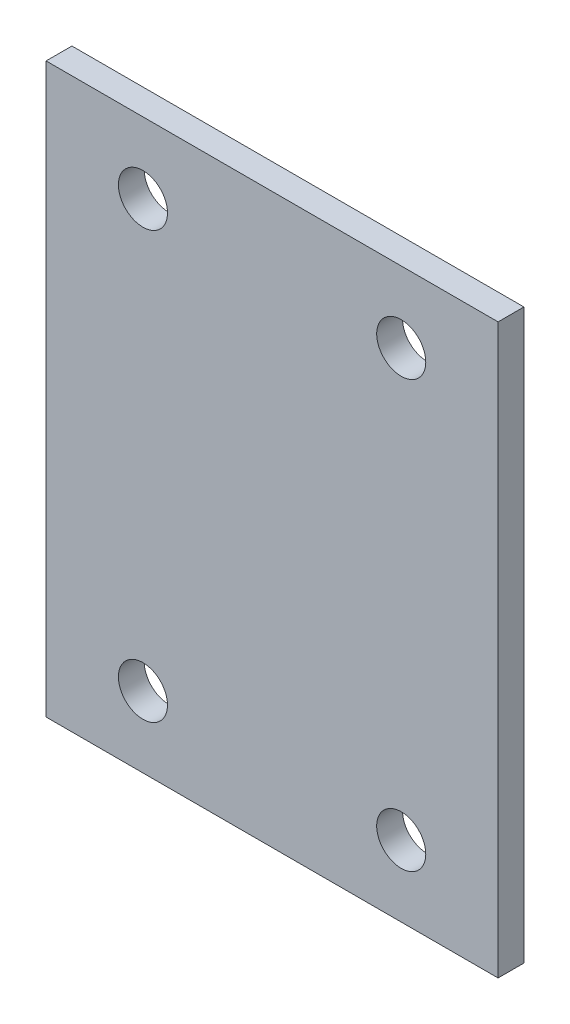
ISO-10303-21;
HEADER;
FILE_DESCRIPTION(('STEP AP214'),'2;1');
FILE_NAME('part.step','',(''),(''),'','','');
FILE_SCHEMA(('AUTOMOTIVE_DESIGN { 1 0 10303 214 1 1 1 1 }'));
ENDSEC;
DATA;
#1=APPLICATION_CONTEXT('core data for automotive mechanical design processes');
#2=APPLICATION_PROTOCOL_DEFINITION('international standard','automotive_design',2000,#1);
#3=PRODUCT_CONTEXT('',#1,'mechanical');
#4=PRODUCT('Part','Part','',(#3));
#5=PRODUCT_RELATED_PRODUCT_CATEGORY('part','',(#4));
#6=PRODUCT_DEFINITION_FORMATION('','',#4);
#7=PRODUCT_DEFINITION_CONTEXT('part definition',#1,'design');
#8=PRODUCT_DEFINITION('design','',#6,#7);
#9=PRODUCT_DEFINITION_SHAPE('','',#8);
#10=(LENGTH_UNIT() NAMED_UNIT(*) SI_UNIT(.MILLI.,.METRE.));
#11=(NAMED_UNIT(*) PLANE_ANGLE_UNIT() SI_UNIT($,.RADIAN.));
#12=(NAMED_UNIT(*) SI_UNIT($,.STERADIAN.) SOLID_ANGLE_UNIT());
#13=UNCERTAINTY_MEASURE_WITH_UNIT(LENGTH_MEASURE(1.E-05),#10,'distance_accuracy_value','');
#14=(GEOMETRIC_REPRESENTATION_CONTEXT(3) GLOBAL_UNCERTAINTY_ASSIGNED_CONTEXT((#13)) GLOBAL_UNIT_ASSIGNED_CONTEXT((#10,
#11,#12)) REPRESENTATION_CONTEXT('',''));
#15=CARTESIAN_POINT('',(0.,0.,0.));
#16=DIRECTION('',(0.,0.,1.));
#17=DIRECTION('',(1.,0.,0.));
#18=AXIS2_PLACEMENT_3D('',#15,#16,#17);
#19=CARTESIAN_POINT('',(0.,0.,20.));
#20=DIRECTION('',(0.,0.,1.));
#21=DIRECTION('',(1.,0.,0.));
#22=AXIS2_PLACEMENT_3D('',#19,#20,#21);
#23=PLANE('',#22);
#24=CARTESIAN_POINT('',(100.,-165.,20.));
#25=DIRECTION('',(0.,0.,1.));
#26=DIRECTION('',(1.,0.,0.));
#27=AXIS2_PLACEMENT_3D('',#24,#25,#26);
#28=CIRCLE('',#27,19.);
#29=CARTESIAN_POINT('',(119.,-165.,20.));
#30=VERTEX_POINT('',#29);
#31=EDGE_CURVE('E123',#30,#30,#28,.T.);
#32=ORIENTED_EDGE('',*,*,#31,.F.);
#33=EDGE_LOOP('',(#32));
#34=FACE_BOUND('',#33,.T.);
#35=CARTESIAN_POINT('',(-100.,165.,20.));
#36=DIRECTION('',(0.,0.,1.));
#37=DIRECTION('',(1.,0.,0.));
#38=AXIS2_PLACEMENT_3D('',#35,#36,#37);
#39=CIRCLE('',#38,19.0000000000034);
#40=CARTESIAN_POINT('',(-80.9999999999966,165.,20.));
#41=VERTEX_POINT('',#40);
#42=EDGE_CURVE('E102',#41,#41,#39,.T.);
#43=ORIENTED_EDGE('',*,*,#42,.F.);
#44=EDGE_LOOP('',(#43));
#45=FACE_BOUND('',#44,.T.);
#46=DIRECTION('',(1.,0.,0.));
#47=VECTOR('',#46,1.);
#48=CARTESIAN_POINT('',(-175.,-220.,20.));
#49=LINE('',#48,#47);
#50=CARTESIAN_POINT('',(-175.,-220.,20.));
#51=VERTEX_POINT('',#50);
#52=CARTESIAN_POINT('',(175.,-220.,20.));
#53=VERTEX_POINT('',#52);
#54=EDGE_CURVE('E87',#51,#53,#49,.T.);
#55=ORIENTED_EDGE('',*,*,#54,.T.);
#56=DIRECTION('',(0.,1.,0.));
#57=VECTOR('',#56,1.);
#58=CARTESIAN_POINT('',(175.,-220.,20.));
#59=LINE('',#58,#57);
#60=CARTESIAN_POINT('',(175.,220.,20.));
#61=VERTEX_POINT('',#60);
#62=EDGE_CURVE('E82',#53,#61,#59,.T.);
#63=ORIENTED_EDGE('',*,*,#62,.T.);
#64=DIRECTION('',(-1.,0.,0.));
#65=VECTOR('',#64,1.);
#66=CARTESIAN_POINT('',(175.,220.,20.));
#67=LINE('',#66,#65);
#68=CARTESIAN_POINT('',(-175.,220.,20.));
#69=VERTEX_POINT('',#68);
#70=EDGE_CURVE('E85',#61,#69,#67,.T.);
#71=ORIENTED_EDGE('',*,*,#70,.T.);
#72=DIRECTION('',(0.,-1.,0.));
#73=VECTOR('',#72,1.);
#74=CARTESIAN_POINT('',(-175.,220.,20.));
#75=LINE('',#74,#73);
#76=EDGE_CURVE('E52',#69,#51,#75,.T.);
#77=ORIENTED_EDGE('',*,*,#76,.T.);
#78=EDGE_LOOP('',(#55,#63,#71,#77));
#79=FACE_BOUND('',#78,.T.);
#80=CARTESIAN_POINT('',(100.,165.,20.));
#81=DIRECTION('',(0.,0.,1.));
#82=DIRECTION('',(1.,0.,0.));
#83=AXIS2_PLACEMENT_3D('',#80,#81,#82);
#84=CIRCLE('',#83,18.999999999996);
#85=CARTESIAN_POINT('',(118.999999999996,165.,20.));
#86=VERTEX_POINT('',#85);
#87=EDGE_CURVE('E117',#86,#86,#84,.T.);
#88=ORIENTED_EDGE('',*,*,#87,.F.);
#89=EDGE_LOOP('',(#88));
#90=FACE_BOUND('',#89,.T.);
#91=CARTESIAN_POINT('',(-100.,-165.,20.));
#92=DIRECTION('',(0.,0.,1.));
#93=DIRECTION('',(1.,0.,0.));
#94=AXIS2_PLACEMENT_3D('',#91,#92,#93);
#95=CIRCLE('',#94,19.);
#96=CARTESIAN_POINT('',(-81.,-165.,20.));
#97=VERTEX_POINT('',#96);
#98=EDGE_CURVE('E129',#97,#97,#95,.T.);
#99=ORIENTED_EDGE('',*,*,#98,.F.);
#100=EDGE_LOOP('',(#99));
#101=FACE_BOUND('',#100,.T.);
#102=ADVANCED_FACE('F35',(#34,#45,#79,#90,#101),#23,.T.);
#103=CARTESIAN_POINT('',(0.,0.,0.));
#104=DIRECTION('',(0.,0.,1.));
#105=DIRECTION('',(1.,0.,0.));
#106=AXIS2_PLACEMENT_3D('',#103,#104,#105);
#107=PLANE('',#106);
#108=DIRECTION('',(1.,0.,0.));
#109=VECTOR('',#108,1.);
#110=CARTESIAN_POINT('',(-175.,-220.,0.));
#111=LINE('',#110,#109);
#112=CARTESIAN_POINT('',(-175.,-220.,0.));
#113=VERTEX_POINT('',#112);
#114=CARTESIAN_POINT('',(175.,-220.,0.));
#115=VERTEX_POINT('',#114);
#116=EDGE_CURVE('E99',#113,#115,#111,.T.);
#117=ORIENTED_EDGE('',*,*,#116,.F.);
#118=DIRECTION('',(0.,-1.,0.));
#119=VECTOR('',#118,1.);
#120=CARTESIAN_POINT('',(-175.,220.,0.));
#121=LINE('',#120,#119);
#122=CARTESIAN_POINT('',(-175.,220.,0.));
#123=VERTEX_POINT('',#122);
#124=EDGE_CURVE('E75',#123,#113,#121,.T.);
#125=ORIENTED_EDGE('',*,*,#124,.F.);
#126=DIRECTION('',(-1.,0.,0.));
#127=VECTOR('',#126,1.);
#128=CARTESIAN_POINT('',(175.,220.,0.));
#129=LINE('',#128,#127);
#130=CARTESIAN_POINT('',(175.,220.,0.));
#131=VERTEX_POINT('',#130);
#132=EDGE_CURVE('E69',#131,#123,#129,.T.);
#133=ORIENTED_EDGE('',*,*,#132,.F.);
#134=DIRECTION('',(0.,1.,0.));
#135=VECTOR('',#134,1.);
#136=CARTESIAN_POINT('',(175.,-220.,0.));
#137=LINE('',#136,#135);
#138=EDGE_CURVE('E91',#115,#131,#137,.T.);
#139=ORIENTED_EDGE('',*,*,#138,.F.);
#140=EDGE_LOOP('',(#117,#125,#133,#139));
#141=FACE_BOUND('',#140,.T.);
#142=CARTESIAN_POINT('',(-100.,165.,0.));
#143=DIRECTION('',(0.,0.,1.));
#144=DIRECTION('',(1.,0.,0.));
#145=AXIS2_PLACEMENT_3D('',#142,#143,#144);
#146=CIRCLE('',#145,19.0000000000034);
#147=CARTESIAN_POINT('',(-80.9999999999966,165.,0.));
#148=VERTEX_POINT('',#147);
#149=EDGE_CURVE('E114',#148,#148,#146,.T.);
#150=ORIENTED_EDGE('',*,*,#149,.T.);
#151=EDGE_LOOP('',(#150));
#152=FACE_BOUND('',#151,.T.);
#153=CARTESIAN_POINT('',(100.,165.,0.));
#154=DIRECTION('',(0.,0.,1.));
#155=DIRECTION('',(1.,0.,0.));
#156=AXIS2_PLACEMENT_3D('',#153,#154,#155);
#157=CIRCLE('',#156,18.999999999996);
#158=CARTESIAN_POINT('',(118.999999999996,165.,0.));
#159=VERTEX_POINT('',#158);
#160=EDGE_CURVE('E120',#159,#159,#157,.T.);
#161=ORIENTED_EDGE('',*,*,#160,.T.);
#162=EDGE_LOOP('',(#161));
#163=FACE_BOUND('',#162,.T.);
#164=CARTESIAN_POINT('',(100.,-165.,0.));
#165=DIRECTION('',(0.,0.,1.));
#166=DIRECTION('',(1.,0.,0.));
#167=AXIS2_PLACEMENT_3D('',#164,#165,#166);
#168=CIRCLE('',#167,19.);
#169=CARTESIAN_POINT('',(119.,-165.,0.));
#170=VERTEX_POINT('',#169);
#171=EDGE_CURVE('E126',#170,#170,#168,.T.);
#172=ORIENTED_EDGE('',*,*,#171,.T.);
#173=EDGE_LOOP('',(#172));
#174=FACE_BOUND('',#173,.T.);
#175=CARTESIAN_POINT('',(-100.,-165.,0.));
#176=DIRECTION('',(0.,0.,1.));
#177=DIRECTION('',(1.,0.,0.));
#178=AXIS2_PLACEMENT_3D('',#175,#176,#177);
#179=CIRCLE('',#178,19.);
#180=CARTESIAN_POINT('',(-81.,-165.,0.));
#181=VERTEX_POINT('',#180);
#182=EDGE_CURVE('E132',#181,#181,#179,.T.);
#183=ORIENTED_EDGE('',*,*,#182,.T.);
#184=EDGE_LOOP('',(#183));
#185=FACE_BOUND('',#184,.T.);
#186=ADVANCED_FACE('F110',(#141,#152,#163,#174,#185),#107,.F.);
#187=CARTESIAN_POINT('',(-175.,-220.,20.));
#188=DIRECTION('',(0.,1.,0.));
#189=DIRECTION('',(0.,0.,1.));
#190=AXIS2_PLACEMENT_3D('',#187,#188,#189);
#191=PLANE('',#190);
#192=ORIENTED_EDGE('',*,*,#116,.T.);
#193=DIRECTION('',(0.,0.,-1.));
#194=VECTOR('',#193,1.);
#195=CARTESIAN_POINT('',(175.,-220.,20.));
#196=LINE('',#195,#194);
#197=EDGE_CURVE('E11',#53,#115,#196,.T.);
#198=ORIENTED_EDGE('',*,*,#197,.F.);
#199=ORIENTED_EDGE('',*,*,#54,.F.);
#200=DIRECTION('',(0.,0.,-1.));
#201=VECTOR('',#200,1.);
#202=CARTESIAN_POINT('',(-175.,-220.,20.));
#203=LINE('',#202,#201);
#204=EDGE_CURVE('E95',#51,#113,#203,.T.);
#205=ORIENTED_EDGE('',*,*,#204,.T.);
#206=EDGE_LOOP('',(#192,#198,#199,#205));
#207=FACE_BOUND('',#206,.T.);
#208=ADVANCED_FACE('F37',(#207),#191,.F.);
#209=CARTESIAN_POINT('',(175.,-220.,20.));
#210=DIRECTION('',(-1.,0.,0.));
#211=DIRECTION('',(0.,0.,1.));
#212=AXIS2_PLACEMENT_3D('',#209,#210,#211);
#213=PLANE('',#212);
#214=ORIENTED_EDGE('',*,*,#138,.T.);
#215=DIRECTION('',(0.,0.,-1.));
#216=VECTOR('',#215,1.);
#217=CARTESIAN_POINT('',(175.,220.,20.));
#218=LINE('',#217,#216);
#219=EDGE_CURVE('E44',#61,#131,#218,.T.);
#220=ORIENTED_EDGE('',*,*,#219,.F.);
#221=ORIENTED_EDGE('',*,*,#62,.F.);
#222=ORIENTED_EDGE('',*,*,#197,.T.);
#223=EDGE_LOOP('',(#214,#220,#221,#222));
#224=FACE_BOUND('',#223,.T.);
#225=ADVANCED_FACE('F90',(#224),#213,.F.);
#226=CARTESIAN_POINT('',(175.,220.,20.));
#227=DIRECTION('',(0.,-1.,0.));
#228=DIRECTION('',(0.,0.,-1.));
#229=AXIS2_PLACEMENT_3D('',#226,#227,#228);
#230=PLANE('',#229);
#231=ORIENTED_EDGE('',*,*,#132,.T.);
#232=DIRECTION('',(0.,0.,-1.));
#233=VECTOR('',#232,1.);
#234=CARTESIAN_POINT('',(-175.,220.,20.));
#235=LINE('',#234,#233);
#236=EDGE_CURVE('E92',#69,#123,#235,.T.);
#237=ORIENTED_EDGE('',*,*,#236,.F.);
#238=ORIENTED_EDGE('',*,*,#70,.F.);
#239=ORIENTED_EDGE('',*,*,#219,.T.);
#240=EDGE_LOOP('',(#231,#237,#238,#239));
#241=FACE_BOUND('',#240,.T.);
#242=ADVANCED_FACE('F93',(#241),#230,.F.);
#243=CARTESIAN_POINT('',(-175.,220.,20.));
#244=DIRECTION('',(1.,0.,0.));
#245=DIRECTION('',(0.,0.,-1.));
#246=AXIS2_PLACEMENT_3D('',#243,#244,#245);
#247=PLANE('',#246);
#248=ORIENTED_EDGE('',*,*,#124,.T.);
#249=ORIENTED_EDGE('',*,*,#204,.F.);
#250=ORIENTED_EDGE('',*,*,#76,.F.);
#251=ORIENTED_EDGE('',*,*,#236,.T.);
#252=EDGE_LOOP('',(#248,#249,#250,#251));
#253=FACE_BOUND('',#252,.T.);
#254=ADVANCED_FACE('F107',(#253),#247,.F.);
#255=CARTESIAN_POINT('',(-100.,165.,20.));
#256=DIRECTION('',(0.,0.,-1.));
#257=DIRECTION('',(-1.,0.,0.));
#258=AXIS2_PLACEMENT_3D('',#255,#256,#257);
#259=CYLINDRICAL_SURFACE('',#258,19.0000000000034);
#260=ORIENTED_EDGE('',*,*,#42,.T.);
#261=EDGE_LOOP('',(#260));
#262=FACE_BOUND('',#261,.T.);
#263=ORIENTED_EDGE('',*,*,#149,.F.);
#264=EDGE_LOOP('',(#263));
#265=FACE_BOUND('',#264,.T.);
#266=ADVANCED_FACE('F151',(#262,#265),#259,.F.);
#267=CARTESIAN_POINT('',(100.,165.,20.));
#268=DIRECTION('',(0.,0.,-1.));
#269=DIRECTION('',(-1.,0.,0.));
#270=AXIS2_PLACEMENT_3D('',#267,#268,#269);
#271=CYLINDRICAL_SURFACE('',#270,18.999999999996);
#272=ORIENTED_EDGE('',*,*,#87,.T.);
#273=EDGE_LOOP('',(#272));
#274=FACE_BOUND('',#273,.T.);
#275=ORIENTED_EDGE('',*,*,#160,.F.);
#276=EDGE_LOOP('',(#275));
#277=FACE_BOUND('',#276,.T.);
#278=ADVANCED_FACE('F197',(#274,#277),#271,.F.);
#279=CARTESIAN_POINT('',(100.,-165.,20.));
#280=DIRECTION('',(0.,0.,-1.));
#281=DIRECTION('',(-1.,0.,0.));
#282=AXIS2_PLACEMENT_3D('',#279,#280,#281);
#283=CYLINDRICAL_SURFACE('',#282,19.);
#284=ORIENTED_EDGE('',*,*,#31,.T.);
#285=EDGE_LOOP('',(#284));
#286=FACE_BOUND('',#285,.T.);
#287=ORIENTED_EDGE('',*,*,#171,.F.);
#288=EDGE_LOOP('',(#287));
#289=FACE_BOUND('',#288,.T.);
#290=ADVANCED_FACE('F205',(#286,#289),#283,.F.);
#291=CARTESIAN_POINT('',(-100.,-165.,20.));
#292=DIRECTION('',(0.,0.,-1.));
#293=DIRECTION('',(-1.,0.,0.));
#294=AXIS2_PLACEMENT_3D('',#291,#292,#293);
#295=CYLINDRICAL_SURFACE('',#294,19.);
#296=ORIENTED_EDGE('',*,*,#98,.T.);
#297=EDGE_LOOP('',(#296));
#298=FACE_BOUND('',#297,.T.);
#299=ORIENTED_EDGE('',*,*,#182,.F.);
#300=EDGE_LOOP('',(#299));
#301=FACE_BOUND('',#300,.T.);
#302=ADVANCED_FACE('F138',(#298,#301),#295,.F.);
#303=CLOSED_SHELL('',(#102,#186,#208,#225,#242,#254,#266,#278,#290,#302));
#304=MANIFOLD_SOLID_BREP('B2',#303);
#305=ADVANCED_BREP_SHAPE_REPRESENTATION('',(#18,#304),#14);
#306=SHAPE_DEFINITION_REPRESENTATION(#9,#305);
ENDSEC;
END-ISO-10303-21;
